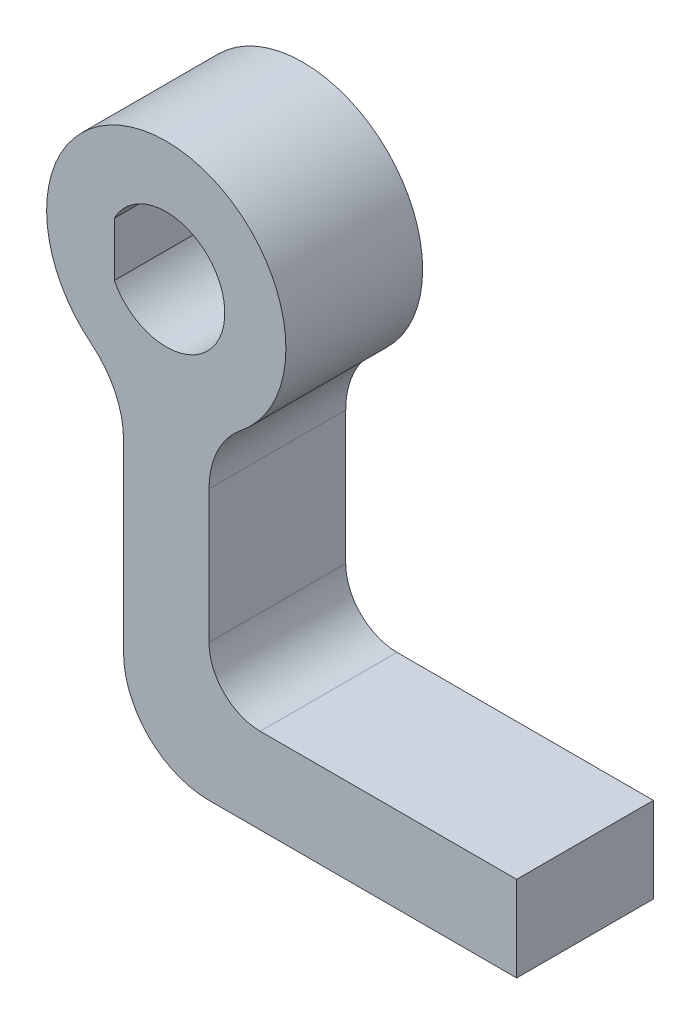
ISO-10303-21;
HEADER;
FILE_DESCRIPTION(('STEP AP214'),'2;1');
FILE_NAME('part.step','',(''),(''),'','','');
FILE_SCHEMA(('AUTOMOTIVE_DESIGN { 1 0 10303 214 1 1 1 1 }'));
ENDSEC;
DATA;
#1=APPLICATION_CONTEXT('core data for automotive mechanical design processes');
#2=APPLICATION_PROTOCOL_DEFINITION('international standard','automotive_design',2000,#1);
#3=PRODUCT_CONTEXT('',#1,'mechanical');
#4=PRODUCT('Part','Part','',(#3));
#5=PRODUCT_RELATED_PRODUCT_CATEGORY('part','',(#4));
#6=PRODUCT_DEFINITION_FORMATION('','',#4);
#7=PRODUCT_DEFINITION_CONTEXT('part definition',#1,'design');
#8=PRODUCT_DEFINITION('design','',#6,#7);
#9=PRODUCT_DEFINITION_SHAPE('','',#8);
#10=(LENGTH_UNIT() NAMED_UNIT(*) SI_UNIT(.MILLI.,.METRE.));
#11=(NAMED_UNIT(*) PLANE_ANGLE_UNIT() SI_UNIT($,.RADIAN.));
#12=(NAMED_UNIT(*) SI_UNIT($,.STERADIAN.) SOLID_ANGLE_UNIT());
#13=UNCERTAINTY_MEASURE_WITH_UNIT(LENGTH_MEASURE(1.E-05),#10,'distance_accuracy_value','');
#14=(GEOMETRIC_REPRESENTATION_CONTEXT(3) GLOBAL_UNCERTAINTY_ASSIGNED_CONTEXT((#13)) GLOBAL_UNIT_ASSIGNED_CONTEXT((#10,
#11,#12)) REPRESENTATION_CONTEXT('',''));
#15=CARTESIAN_POINT('',(0.,0.,0.));
#16=DIRECTION('',(0.,0.,1.));
#17=DIRECTION('',(1.,0.,0.));
#18=AXIS2_PLACEMENT_3D('',#15,#16,#17);
#19=CARTESIAN_POINT('',(5.5,-17.15,4.));
#20=DIRECTION('',(0.,0.,-1.));
#21=DIRECTION('',(-1.,0.,0.));
#22=AXIS2_PLACEMENT_3D('',#19,#20,#21);
#23=PLANE('',#22);
#24=CARTESIAN_POINT('',(5.5,-17.15,4.));
#25=DIRECTION('',(0.,0.,-1.));
#26=DIRECTION('',(-1.,0.,0.));
#27=AXIS2_PLACEMENT_3D('',#24,#25,#26);
#28=CIRCLE('',#27,3.);
#29=CARTESIAN_POINT('',(5.5,-20.15,4.));
#30=VERTEX_POINT('',#29);
#31=CARTESIAN_POINT('',(2.5,-17.15,4.));
#32=VERTEX_POINT('',#31);
#33=EDGE_CURVE('E138',#30,#32,#28,.T.);
#34=ORIENTED_EDGE('',*,*,#33,.T.);
#35=DIRECTION('',(0.,1.,0.));
#36=VECTOR('',#35,1.);
#37=CARTESIAN_POINT('',(2.5,-17.15,4.));
#38=LINE('',#37,#36);
#39=CARTESIAN_POINT('',(2.5,-9.3674969975976,4.));
#40=VERTEX_POINT('',#39);
#41=EDGE_CURVE('E141',#32,#40,#38,.T.);
#42=ORIENTED_EDGE('',*,*,#41,.T.);
#43=CARTESIAN_POINT('',(7.5,-9.3674969975976,4.));
#44=DIRECTION('',(0.,0.,-1.));
#45=DIRECTION('',(-1.,0.,0.));
#46=AXIS2_PLACEMENT_3D('',#43,#44,#45);
#47=CIRCLE('',#46,5.);
#48=CARTESIAN_POINT('',(4.375,-5.4643732485986,4.));
#49=VERTEX_POINT('',#48);
#50=EDGE_CURVE('E144',#40,#49,#47,.T.);
#51=ORIENTED_EDGE('',*,*,#50,.T.);
#52=CARTESIAN_POINT('',(0.,0.,4.));
#53=DIRECTION('',(0.,0.,1.));
#54=DIRECTION('',(1.,0.,0.));
#55=AXIS2_PLACEMENT_3D('',#52,#53,#54);
#56=CIRCLE('',#55,7.);
#57=CARTESIAN_POINT('',(-4.375,-5.4643732485986,4.));
#58=VERTEX_POINT('',#57);
#59=EDGE_CURVE('E146',#49,#58,#56,.T.);
#60=ORIENTED_EDGE('',*,*,#59,.T.);
#61=CARTESIAN_POINT('',(-7.5,-9.3674969975976,4.));
#62=DIRECTION('',(0.,0.,-1.));
#63=DIRECTION('',(1.,0.,0.));
#64=AXIS2_PLACEMENT_3D('',#61,#62,#63);
#65=CIRCLE('',#64,5.);
#66=CARTESIAN_POINT('',(-2.5,-9.3674969975976,4.));
#67=VERTEX_POINT('',#66);
#68=EDGE_CURVE('E148',#58,#67,#65,.T.);
#69=ORIENTED_EDGE('',*,*,#68,.T.);
#70=DIRECTION('',(0.,-1.,0.));
#71=VECTOR('',#70,1.);
#72=CARTESIAN_POINT('',(-2.5,-9.3674969975976,4.));
#73=LINE('',#72,#71);
#74=CARTESIAN_POINT('',(-2.5,-20.15,4.));
#75=VERTEX_POINT('',#74);
#76=EDGE_CURVE('E150',#67,#75,#73,.T.);
#77=ORIENTED_EDGE('',*,*,#76,.T.);
#78=CARTESIAN_POINT('',(2.5,-20.15,4.));
#79=DIRECTION('',(0.,0.,1.));
#80=DIRECTION('',(-1.,0.,0.));
#81=AXIS2_PLACEMENT_3D('',#78,#79,#80);
#82=CIRCLE('',#81,5.);
#83=CARTESIAN_POINT('',(2.5,-25.15,4.));
#84=VERTEX_POINT('',#83);
#85=EDGE_CURVE('E152',#75,#84,#82,.T.);
#86=ORIENTED_EDGE('',*,*,#85,.T.);
#87=DIRECTION('',(1.,0.,0.));
#88=VECTOR('',#87,1.);
#89=CARTESIAN_POINT('',(2.5,-25.15,4.));
#90=LINE('',#89,#88);
#91=CARTESIAN_POINT('',(20.5,-25.15,4.));
#92=VERTEX_POINT('',#91);
#93=EDGE_CURVE('E154',#84,#92,#90,.T.);
#94=ORIENTED_EDGE('',*,*,#93,.T.);
#95=DIRECTION('',(0.,1.,0.));
#96=VECTOR('',#95,1.);
#97=CARTESIAN_POINT('',(20.5,-25.15,4.));
#98=LINE('',#97,#96);
#99=CARTESIAN_POINT('',(20.5,-20.15,4.));
#100=VERTEX_POINT('',#99);
#101=EDGE_CURVE('E156',#92,#100,#98,.T.);
#102=ORIENTED_EDGE('',*,*,#101,.T.);
#103=DIRECTION('',(-1.,0.,0.));
#104=VECTOR('',#103,1.);
#105=CARTESIAN_POINT('',(20.5,-20.15,4.));
#106=LINE('',#105,#104);
#107=EDGE_CURVE('E158',#100,#30,#106,.T.);
#108=ORIENTED_EDGE('',*,*,#107,.T.);
#109=EDGE_LOOP('',(#34,#42,#51,#60,#69,#77,#86,#94,#102,#108));
#110=FACE_BOUND('',#109,.T.);
#111=CARTESIAN_POINT('',(0.,0.,4.));
#112=DIRECTION('',(0.,0.,1.));
#113=DIRECTION('',(1.,0.,0.));
#114=AXIS2_PLACEMENT_3D('',#111,#112,#113);
#115=CIRCLE('',#114,3.425);
#116=CARTESIAN_POINT('',(-3.04,-1.57766441298522,4.));
#117=VERTEX_POINT('',#116);
#118=CARTESIAN_POINT('',(-3.04,1.57766441298522,4.));
#119=VERTEX_POINT('',#118);
#120=EDGE_CURVE('E127',#117,#119,#115,.T.);
#121=ORIENTED_EDGE('',*,*,#120,.F.);
#122=DIRECTION('',(0.,-1.,0.));
#123=VECTOR('',#122,1.);
#124=CARTESIAN_POINT('',(-3.04,1.57766441298522,4.));
#125=LINE('',#124,#123);
#126=EDGE_CURVE('E121',#119,#117,#125,.T.);
#127=ORIENTED_EDGE('',*,*,#126,.F.);
#128=EDGE_LOOP('',(#121,#127));
#129=FACE_BOUND('',#128,.T.);
#130=ADVANCED_FACE('F33',(#110,#129),#23,.F.);
#131=CARTESIAN_POINT('',(5.5,-17.15,-4.));
#132=DIRECTION('',(0.,0.,-1.));
#133=DIRECTION('',(-1.,0.,0.));
#134=AXIS2_PLACEMENT_3D('',#131,#132,#133);
#135=PLANE('',#134);
#136=CARTESIAN_POINT('',(5.5,-17.15,-4.));
#137=DIRECTION('',(0.,0.,-1.));
#138=DIRECTION('',(-1.,0.,0.));
#139=AXIS2_PLACEMENT_3D('',#136,#137,#138);
#140=CIRCLE('',#139,3.);
#141=CARTESIAN_POINT('',(5.5,-20.15,-4.));
#142=VERTEX_POINT('',#141);
#143=CARTESIAN_POINT('',(2.5,-17.15,-4.));
#144=VERTEX_POINT('',#143);
#145=EDGE_CURVE('E137',#142,#144,#140,.T.);
#146=ORIENTED_EDGE('',*,*,#145,.F.);
#147=DIRECTION('',(-1.,0.,0.));
#148=VECTOR('',#147,1.);
#149=CARTESIAN_POINT('',(20.5,-20.15,-4.));
#150=LINE('',#149,#148);
#151=CARTESIAN_POINT('',(20.5,-20.15,-4.));
#152=VERTEX_POINT('',#151);
#153=EDGE_CURVE('E142',#152,#142,#150,.T.);
#154=ORIENTED_EDGE('',*,*,#153,.F.);
#155=DIRECTION('',(0.,1.,0.));
#156=VECTOR('',#155,1.);
#157=CARTESIAN_POINT('',(20.5,-25.15,-4.));
#158=LINE('',#157,#156);
#159=CARTESIAN_POINT('',(20.5,-25.15,-4.));
#160=VERTEX_POINT('',#159);
#161=EDGE_CURVE('E177',#160,#152,#158,.T.);
#162=ORIENTED_EDGE('',*,*,#161,.F.);
#163=DIRECTION('',(1.,0.,0.));
#164=VECTOR('',#163,1.);
#165=CARTESIAN_POINT('',(2.5,-25.15,-4.));
#166=LINE('',#165,#164);
#167=CARTESIAN_POINT('',(2.5,-25.15,-4.));
#168=VERTEX_POINT('',#167);
#169=EDGE_CURVE('E175',#168,#160,#166,.T.);
#170=ORIENTED_EDGE('',*,*,#169,.F.);
#171=CARTESIAN_POINT('',(2.5,-20.15,-4.));
#172=DIRECTION('',(0.,0.,1.));
#173=DIRECTION('',(-1.,0.,0.));
#174=AXIS2_PLACEMENT_3D('',#171,#172,#173);
#175=CIRCLE('',#174,5.);
#176=CARTESIAN_POINT('',(-2.5,-20.15,-4.));
#177=VERTEX_POINT('',#176);
#178=EDGE_CURVE('E173',#177,#168,#175,.T.);
#179=ORIENTED_EDGE('',*,*,#178,.F.);
#180=DIRECTION('',(0.,-1.,0.));
#181=VECTOR('',#180,1.);
#182=CARTESIAN_POINT('',(-2.5,-9.3674969975976,-4.));
#183=LINE('',#182,#181);
#184=CARTESIAN_POINT('',(-2.5,-9.3674969975976,-4.));
#185=VERTEX_POINT('',#184);
#186=EDGE_CURVE('E171',#185,#177,#183,.T.);
#187=ORIENTED_EDGE('',*,*,#186,.F.);
#188=CARTESIAN_POINT('',(-7.5,-9.3674969975976,-4.));
#189=DIRECTION('',(0.,0.,-1.));
#190=DIRECTION('',(1.,0.,0.));
#191=AXIS2_PLACEMENT_3D('',#188,#189,#190);
#192=CIRCLE('',#191,5.);
#193=CARTESIAN_POINT('',(-4.375,-5.4643732485986,-4.));
#194=VERTEX_POINT('',#193);
#195=EDGE_CURVE('E169',#194,#185,#192,.T.);
#196=ORIENTED_EDGE('',*,*,#195,.F.);
#197=CARTESIAN_POINT('',(0.,0.,-4.));
#198=DIRECTION('',(0.,0.,1.));
#199=DIRECTION('',(1.,0.,0.));
#200=AXIS2_PLACEMENT_3D('',#197,#198,#199);
#201=CIRCLE('',#200,7.);
#202=CARTESIAN_POINT('',(4.375,-5.4643732485986,-4.));
#203=VERTEX_POINT('',#202);
#204=EDGE_CURVE('E167',#203,#194,#201,.T.);
#205=ORIENTED_EDGE('',*,*,#204,.F.);
#206=CARTESIAN_POINT('',(7.5,-9.3674969975976,-4.));
#207=DIRECTION('',(0.,0.,-1.));
#208=DIRECTION('',(-1.,0.,0.));
#209=AXIS2_PLACEMENT_3D('',#206,#207,#208);
#210=CIRCLE('',#209,5.);
#211=CARTESIAN_POINT('',(2.5,-9.3674969975976,-4.));
#212=VERTEX_POINT('',#211);
#213=EDGE_CURVE('E165',#212,#203,#210,.T.);
#214=ORIENTED_EDGE('',*,*,#213,.F.);
#215=DIRECTION('',(0.,1.,0.));
#216=VECTOR('',#215,1.);
#217=CARTESIAN_POINT('',(2.5,-17.15,-4.));
#218=LINE('',#217,#216);
#219=EDGE_CURVE('E163',#144,#212,#218,.T.);
#220=ORIENTED_EDGE('',*,*,#219,.F.);
#221=EDGE_LOOP('',(#146,#154,#162,#170,#179,#187,#196,#205,#214,#220));
#222=FACE_BOUND('',#221,.T.);
#223=DIRECTION('',(0.,-1.,0.));
#224=VECTOR('',#223,1.);
#225=CARTESIAN_POINT('',(-3.04,1.57766441298522,-4.));
#226=LINE('',#225,#224);
#227=CARTESIAN_POINT('',(-3.04,1.57766441298522,-4.));
#228=VERTEX_POINT('',#227);
#229=CARTESIAN_POINT('',(-3.04,-1.57766441298522,-4.));
#230=VERTEX_POINT('',#229);
#231=EDGE_CURVE('E131',#228,#230,#226,.T.);
#232=ORIENTED_EDGE('',*,*,#231,.T.);
#233=CARTESIAN_POINT('',(0.,0.,-4.));
#234=DIRECTION('',(0.,0.,1.));
#235=DIRECTION('',(1.,0.,0.));
#236=AXIS2_PLACEMENT_3D('',#233,#234,#235);
#237=CIRCLE('',#236,3.425);
#238=EDGE_CURVE('E55',#230,#228,#237,.T.);
#239=ORIENTED_EDGE('',*,*,#238,.T.);
#240=EDGE_LOOP('',(#232,#239));
#241=FACE_BOUND('',#240,.T.);
#242=ADVANCED_FACE('F213',(#222,#241),#135,.T.);
#243=CARTESIAN_POINT('',(5.5,-17.15,4.));
#244=DIRECTION('',(0.,0.,-1.));
#245=DIRECTION('',(-1.,0.,0.));
#246=AXIS2_PLACEMENT_3D('',#243,#244,#245);
#247=CYLINDRICAL_SURFACE('',#246,3.);
#248=ORIENTED_EDGE('',*,*,#145,.T.);
#249=DIRECTION('',(0.,0.,-1.));
#250=VECTOR('',#249,1.);
#251=CARTESIAN_POINT('',(2.5,-17.15,4.));
#252=LINE('',#251,#250);
#253=EDGE_CURVE('E11',#32,#144,#252,.T.);
#254=ORIENTED_EDGE('',*,*,#253,.F.);
#255=ORIENTED_EDGE('',*,*,#33,.F.);
#256=DIRECTION('',(0.,0.,-1.));
#257=VECTOR('',#256,1.);
#258=CARTESIAN_POINT('',(5.5,-20.15,4.));
#259=LINE('',#258,#257);
#260=EDGE_CURVE('E160',#30,#142,#259,.T.);
#261=ORIENTED_EDGE('',*,*,#260,.T.);
#262=EDGE_LOOP('',(#248,#254,#255,#261));
#263=FACE_BOUND('',#262,.T.);
#264=ADVANCED_FACE('F35',(#263),#247,.F.);
#265=CARTESIAN_POINT('',(2.5,-17.15,4.));
#266=DIRECTION('',(-1.,0.,0.));
#267=DIRECTION('',(0.,-1.,0.));
#268=AXIS2_PLACEMENT_3D('',#265,#266,#267);
#269=PLANE('',#268);
#270=ORIENTED_EDGE('',*,*,#219,.T.);
#271=DIRECTION('',(0.,0.,-1.));
#272=VECTOR('',#271,1.);
#273=CARTESIAN_POINT('',(2.5,-9.3674969975976,4.));
#274=LINE('',#273,#272);
#275=EDGE_CURVE('E41',#40,#212,#274,.T.);
#276=ORIENTED_EDGE('',*,*,#275,.F.);
#277=ORIENTED_EDGE('',*,*,#41,.F.);
#278=ORIENTED_EDGE('',*,*,#253,.T.);
#279=EDGE_LOOP('',(#270,#276,#277,#278));
#280=FACE_BOUND('',#279,.T.);
#281=ADVANCED_FACE('F230',(#280),#269,.F.);
#282=CARTESIAN_POINT('',(7.5,-9.3674969975976,4.));
#283=DIRECTION('',(0.,0.,-1.));
#284=DIRECTION('',(-1.,0.,0.));
#285=AXIS2_PLACEMENT_3D('',#282,#283,#284);
#286=CYLINDRICAL_SURFACE('',#285,5.);
#287=ORIENTED_EDGE('',*,*,#213,.T.);
#288=DIRECTION('',(0.,0.,-1.));
#289=VECTOR('',#288,1.);
#290=CARTESIAN_POINT('',(4.375,-5.4643732485986,4.));
#291=LINE('',#290,#289);
#292=EDGE_CURVE('E200',#49,#203,#291,.T.);
#293=ORIENTED_EDGE('',*,*,#292,.F.);
#294=ORIENTED_EDGE('',*,*,#50,.F.);
#295=ORIENTED_EDGE('',*,*,#275,.T.);
#296=EDGE_LOOP('',(#287,#293,#294,#295));
#297=FACE_BOUND('',#296,.T.);
#298=ADVANCED_FACE('F207',(#297),#286,.F.);
#299=CARTESIAN_POINT('',(0.,0.,4.));
#300=DIRECTION('',(0.,0.,-1.));
#301=DIRECTION('',(-1.,0.,0.));
#302=AXIS2_PLACEMENT_3D('',#299,#300,#301);
#303=CYLINDRICAL_SURFACE('',#302,7.);
#304=ORIENTED_EDGE('',*,*,#204,.T.);
#305=DIRECTION('',(0.,0.,-1.));
#306=VECTOR('',#305,1.);
#307=CARTESIAN_POINT('',(-4.375,-5.4643732485986,4.));
#308=LINE('',#307,#306);
#309=EDGE_CURVE('E197',#58,#194,#308,.T.);
#310=ORIENTED_EDGE('',*,*,#309,.F.);
#311=ORIENTED_EDGE('',*,*,#59,.F.);
#312=ORIENTED_EDGE('',*,*,#292,.T.);
#313=EDGE_LOOP('',(#304,#310,#311,#312));
#314=FACE_BOUND('',#313,.T.);
#315=ADVANCED_FACE('F219',(#314),#303,.T.);
#316=CARTESIAN_POINT('',(-7.5,-9.3674969975976,4.));
#317=DIRECTION('',(0.,0.,-1.));
#318=DIRECTION('',(-1.,0.,0.));
#319=AXIS2_PLACEMENT_3D('',#316,#317,#318);
#320=CYLINDRICAL_SURFACE('',#319,5.);
#321=ORIENTED_EDGE('',*,*,#195,.T.);
#322=DIRECTION('',(0.,0.,-1.));
#323=VECTOR('',#322,1.);
#324=CARTESIAN_POINT('',(-2.5,-9.3674969975976,4.));
#325=LINE('',#324,#323);
#326=EDGE_CURVE('E194',#67,#185,#325,.T.);
#327=ORIENTED_EDGE('',*,*,#326,.F.);
#328=ORIENTED_EDGE('',*,*,#68,.F.);
#329=ORIENTED_EDGE('',*,*,#309,.T.);
#330=EDGE_LOOP('',(#321,#327,#328,#329));
#331=FACE_BOUND('',#330,.T.);
#332=ADVANCED_FACE('F223',(#331),#320,.F.);
#333=CARTESIAN_POINT('',(-2.5,-9.3674969975976,4.));
#334=DIRECTION('',(1.,0.,0.));
#335=DIRECTION('',(0.,1.,0.));
#336=AXIS2_PLACEMENT_3D('',#333,#334,#335);
#337=PLANE('',#336);
#338=ORIENTED_EDGE('',*,*,#186,.T.);
#339=DIRECTION('',(0.,0.,-1.));
#340=VECTOR('',#339,1.);
#341=CARTESIAN_POINT('',(-2.5,-20.15,4.));
#342=LINE('',#341,#340);
#343=EDGE_CURVE('E191',#75,#177,#342,.T.);
#344=ORIENTED_EDGE('',*,*,#343,.F.);
#345=ORIENTED_EDGE('',*,*,#76,.F.);
#346=ORIENTED_EDGE('',*,*,#326,.T.);
#347=EDGE_LOOP('',(#338,#344,#345,#346));
#348=FACE_BOUND('',#347,.T.);
#349=ADVANCED_FACE('F253',(#348),#337,.F.);
#350=CARTESIAN_POINT('',(2.5,-20.15,4.));
#351=DIRECTION('',(0.,0.,-1.));
#352=DIRECTION('',(-1.,0.,0.));
#353=AXIS2_PLACEMENT_3D('',#350,#351,#352);
#354=CYLINDRICAL_SURFACE('',#353,5.);
#355=ORIENTED_EDGE('',*,*,#178,.T.);
#356=DIRECTION('',(0.,0.,-1.));
#357=VECTOR('',#356,1.);
#358=CARTESIAN_POINT('',(2.5,-25.15,4.));
#359=LINE('',#358,#357);
#360=EDGE_CURVE('E188',#84,#168,#359,.T.);
#361=ORIENTED_EDGE('',*,*,#360,.F.);
#362=ORIENTED_EDGE('',*,*,#85,.F.);
#363=ORIENTED_EDGE('',*,*,#343,.T.);
#364=EDGE_LOOP('',(#355,#361,#362,#363));
#365=FACE_BOUND('',#364,.T.);
#366=ADVANCED_FACE('F250',(#365),#354,.T.);
#367=CARTESIAN_POINT('',(2.5,-25.15,4.));
#368=DIRECTION('',(0.,1.,0.));
#369=DIRECTION('',(0.,0.,1.));
#370=AXIS2_PLACEMENT_3D('',#367,#368,#369);
#371=PLANE('',#370);
#372=ORIENTED_EDGE('',*,*,#169,.T.);
#373=DIRECTION('',(0.,0.,-1.));
#374=VECTOR('',#373,1.);
#375=CARTESIAN_POINT('',(20.5,-25.15,4.));
#376=LINE('',#375,#374);
#377=EDGE_CURVE('E185',#92,#160,#376,.T.);
#378=ORIENTED_EDGE('',*,*,#377,.F.);
#379=ORIENTED_EDGE('',*,*,#93,.F.);
#380=ORIENTED_EDGE('',*,*,#360,.T.);
#381=EDGE_LOOP('',(#372,#378,#379,#380));
#382=FACE_BOUND('',#381,.T.);
#383=ADVANCED_FACE('F246',(#382),#371,.F.);
#384=CARTESIAN_POINT('',(20.5,-25.15,4.));
#385=DIRECTION('',(-1.,0.,0.));
#386=DIRECTION('',(0.,0.,1.));
#387=AXIS2_PLACEMENT_3D('',#384,#385,#386);
#388=PLANE('',#387);
#389=ORIENTED_EDGE('',*,*,#161,.T.);
#390=DIRECTION('',(0.,0.,-1.));
#391=VECTOR('',#390,1.);
#392=CARTESIAN_POINT('',(20.5,-20.15,4.));
#393=LINE('',#392,#391);
#394=EDGE_CURVE('E182',#100,#152,#393,.T.);
#395=ORIENTED_EDGE('',*,*,#394,.F.);
#396=ORIENTED_EDGE('',*,*,#101,.F.);
#397=ORIENTED_EDGE('',*,*,#377,.T.);
#398=EDGE_LOOP('',(#389,#395,#396,#397));
#399=FACE_BOUND('',#398,.T.);
#400=ADVANCED_FACE('F242',(#399),#388,.F.);
#401=CARTESIAN_POINT('',(20.5,-20.15,4.));
#402=DIRECTION('',(0.,-1.,0.));
#403=DIRECTION('',(0.,0.,-1.));
#404=AXIS2_PLACEMENT_3D('',#401,#402,#403);
#405=PLANE('',#404);
#406=ORIENTED_EDGE('',*,*,#153,.T.);
#407=ORIENTED_EDGE('',*,*,#260,.F.);
#408=ORIENTED_EDGE('',*,*,#107,.F.);
#409=ORIENTED_EDGE('',*,*,#394,.T.);
#410=EDGE_LOOP('',(#406,#407,#408,#409));
#411=FACE_BOUND('',#410,.T.);
#412=ADVANCED_FACE('F237',(#411),#405,.F.);
#413=CARTESIAN_POINT('',(0.,0.,4.));
#414=DIRECTION('',(0.,0.,-1.));
#415=DIRECTION('',(-1.,0.,0.));
#416=AXIS2_PLACEMENT_3D('',#413,#414,#415);
#417=CYLINDRICAL_SURFACE('',#416,3.425);
#418=ORIENTED_EDGE('',*,*,#238,.F.);
#419=DIRECTION('',(0.,0.,-1.));
#420=VECTOR('',#419,1.);
#421=CARTESIAN_POINT('',(-3.04,-1.57766441298522,4.));
#422=LINE('',#421,#420);
#423=EDGE_CURVE('E123',#117,#230,#422,.T.);
#424=ORIENTED_EDGE('',*,*,#423,.F.);
#425=ORIENTED_EDGE('',*,*,#120,.T.);
#426=DIRECTION('',(0.,0.,-1.));
#427=VECTOR('',#426,1.);
#428=CARTESIAN_POINT('',(-3.04,1.57766441298522,4.));
#429=LINE('',#428,#427);
#430=EDGE_CURVE('E48',#119,#228,#429,.T.);
#431=ORIENTED_EDGE('',*,*,#430,.T.);
#432=EDGE_LOOP('',(#418,#424,#425,#431));
#433=FACE_BOUND('',#432,.T.);
#434=ADVANCED_FACE('F129',(#433),#417,.F.);
#435=CARTESIAN_POINT('',(-3.04,1.57766441298522,4.));
#436=DIRECTION('',(1.,0.,0.));
#437=DIRECTION('',(0.,0.,-1.));
#438=AXIS2_PLACEMENT_3D('',#435,#436,#437);
#439=PLANE('',#438);
#440=ORIENTED_EDGE('',*,*,#231,.F.);
#441=ORIENTED_EDGE('',*,*,#430,.F.);
#442=ORIENTED_EDGE('',*,*,#126,.T.);
#443=ORIENTED_EDGE('',*,*,#423,.T.);
#444=EDGE_LOOP('',(#440,#441,#442,#443));
#445=FACE_BOUND('',#444,.T.);
#446=ADVANCED_FACE('F122',(#445),#439,.T.);
#447=CLOSED_SHELL('',(#130,#242,#264,#281,#298,#315,#332,#349,#366,#383,#400,#412,#434,#446));
#448=MANIFOLD_SOLID_BREP('B2',#447);
#449=ADVANCED_BREP_SHAPE_REPRESENTATION('',(#18,#448),#14);
#450=SHAPE_DEFINITION_REPRESENTATION(#9,#449);
ENDSEC;
END-ISO-10303-21;
